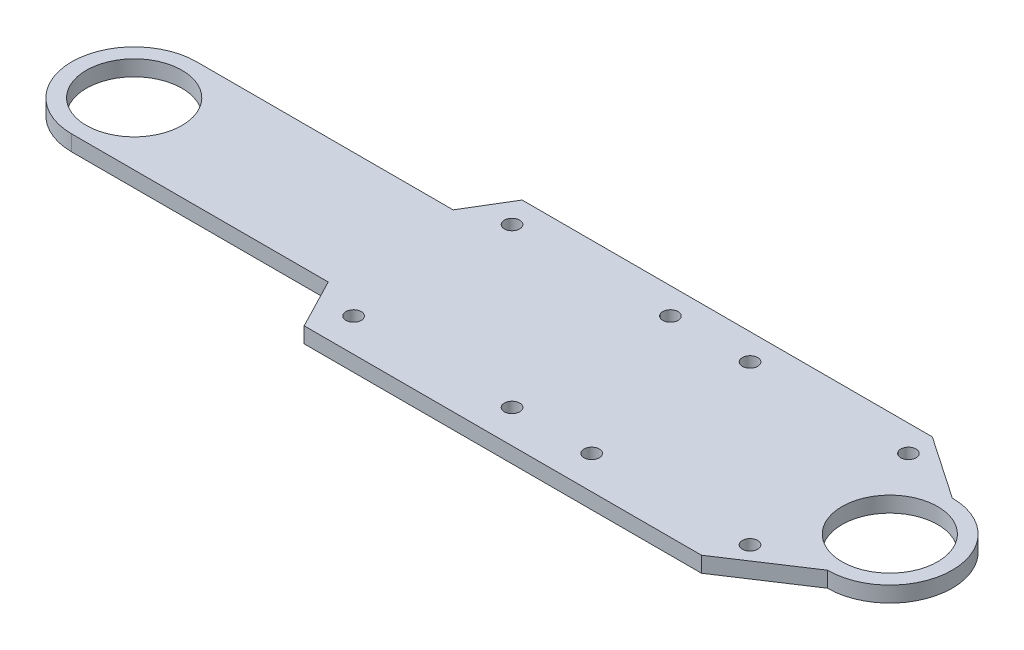
ISO-10303-21;
HEADER;
FILE_DESCRIPTION(('STEP AP214'),'2;1');
FILE_NAME('part.step','',(''),(''),'','','');
FILE_SCHEMA(('AUTOMOTIVE_DESIGN { 1 0 10303 214 1 1 1 1 }'));
ENDSEC;
DATA;
#1=APPLICATION_CONTEXT('core data for automotive mechanical design processes');
#2=APPLICATION_PROTOCOL_DEFINITION('international standard','automotive_design',2000,#1);
#3=PRODUCT_CONTEXT('',#1,'mechanical');
#4=PRODUCT('Part','Part','',(#3));
#5=PRODUCT_RELATED_PRODUCT_CATEGORY('part','',(#4));
#6=PRODUCT_DEFINITION_FORMATION('','',#4);
#7=PRODUCT_DEFINITION_CONTEXT('part definition',#1,'design');
#8=PRODUCT_DEFINITION('design','',#6,#7);
#9=PRODUCT_DEFINITION_SHAPE('','',#8);
#10=(LENGTH_UNIT() NAMED_UNIT(*) SI_UNIT(.MILLI.,.METRE.));
#11=(NAMED_UNIT(*) PLANE_ANGLE_UNIT() SI_UNIT($,.RADIAN.));
#12=(NAMED_UNIT(*) SI_UNIT($,.STERADIAN.) SOLID_ANGLE_UNIT());
#13=UNCERTAINTY_MEASURE_WITH_UNIT(LENGTH_MEASURE(1.E-05),#10,'distance_accuracy_value','');
#14=(GEOMETRIC_REPRESENTATION_CONTEXT(3) GLOBAL_UNCERTAINTY_ASSIGNED_CONTEXT((#13)) GLOBAL_UNIT_ASSIGNED_CONTEXT((#10,
#11,#12)) REPRESENTATION_CONTEXT('',''));
#15=CARTESIAN_POINT('',(0.,0.,0.));
#16=DIRECTION('',(0.,0.,1.));
#17=DIRECTION('',(1.,0.,0.));
#18=AXIS2_PLACEMENT_3D('',#15,#16,#17);
#19=CARTESIAN_POINT('',(180.,1.53,-25.34));
#20=DIRECTION('',(0.,-1.,0.));
#21=DIRECTION('',(0.,0.,-1.));
#22=AXIS2_PLACEMENT_3D('',#19,#20,#21);
#23=PLANE('',#22);
#24=CARTESIAN_POINT('',(163.76,1.53,0.));
#25=DIRECTION('',(0.,1.,0.));
#26=DIRECTION('',(0.,0.,1.));
#27=AXIS2_PLACEMENT_3D('',#24,#25,#26);
#28=CIRCLE('',#27,9.36);
#29=CARTESIAN_POINT('',(163.76,1.53,9.36));
#30=VERTEX_POINT('',#29);
#31=EDGE_CURVE('E176',#30,#30,#28,.T.);
#32=ORIENTED_EDGE('',*,*,#31,.F.);
#33=EDGE_LOOP('',(#32));
#34=FACE_BOUND('',#33,.T.);
#35=CARTESIAN_POINT('',(151.9,1.52999999999999,15.5000000000001));
#36=DIRECTION('',(0.,1.,0.));
#37=DIRECTION('',(0.,0.,1.));
#38=AXIS2_PLACEMENT_3D('',#35,#36,#37);
#39=CIRCLE('',#38,1.5);
#40=CARTESIAN_POINT('',(151.9,1.52999999999999,17.0000000000001));
#41=VERTEX_POINT('',#40);
#42=EDGE_CURVE('E196',#41,#41,#39,.T.);
#43=ORIENTED_EDGE('',*,*,#42,.F.);
#44=EDGE_LOOP('',(#43));
#45=FACE_BOUND('',#44,.T.);
#46=CARTESIAN_POINT('',(151.9,1.53,-15.5));
#47=DIRECTION('',(0.,1.,0.));
#48=DIRECTION('',(0.,0.,1.));
#49=AXIS2_PLACEMENT_3D('',#46,#47,#48);
#50=CIRCLE('',#49,1.5);
#51=CARTESIAN_POINT('',(151.9,1.53,-14.));
#52=VERTEX_POINT('',#51);
#53=EDGE_CURVE('E202',#52,#52,#50,.T.);
#54=ORIENTED_EDGE('',*,*,#53,.F.);
#55=EDGE_LOOP('',(#54));
#56=FACE_BOUND('',#55,.T.);
#57=CARTESIAN_POINT('',(120.9,1.52999999999999,15.5000000000001));
#58=DIRECTION('',(0.,1.,0.));
#59=DIRECTION('',(0.,0.,1.));
#60=AXIS2_PLACEMENT_3D('',#57,#58,#59);
#61=CIRCLE('',#60,1.5);
#62=CARTESIAN_POINT('',(120.9,1.52999999999999,17.));
#63=VERTEX_POINT('',#62);
#64=EDGE_CURVE('E208',#63,#63,#61,.T.);
#65=ORIENTED_EDGE('',*,*,#64,.F.);
#66=EDGE_LOOP('',(#65));
#67=FACE_BOUND('',#66,.T.);
#68=CARTESIAN_POINT('',(120.9,1.53,-15.5));
#69=DIRECTION('',(0.,1.,0.));
#70=DIRECTION('',(0.,0.,1.));
#71=AXIS2_PLACEMENT_3D('',#68,#69,#70);
#72=CIRCLE('',#71,1.5);
#73=CARTESIAN_POINT('',(120.9,1.53,-14.));
#74=VERTEX_POINT('',#73);
#75=EDGE_CURVE('E214',#74,#74,#72,.T.);
#76=ORIENTED_EDGE('',*,*,#75,.F.);
#77=EDGE_LOOP('',(#76));
#78=FACE_BOUND('',#77,.T.);
#79=CARTESIAN_POINT('',(105.32,1.52999999999999,15.5));
#80=DIRECTION('',(0.,1.,0.));
#81=DIRECTION('',(0.,0.,1.));
#82=AXIS2_PLACEMENT_3D('',#79,#80,#81);
#83=CIRCLE('',#82,1.5);
#84=CARTESIAN_POINT('',(105.32,1.52999999999999,17.));
#85=VERTEX_POINT('',#84);
#86=EDGE_CURVE('E220',#85,#85,#83,.T.);
#87=ORIENTED_EDGE('',*,*,#86,.F.);
#88=EDGE_LOOP('',(#87));
#89=FACE_BOUND('',#88,.T.);
#90=CARTESIAN_POINT('',(105.32,1.53,-15.5));
#91=DIRECTION('',(0.,1.,0.));
#92=DIRECTION('',(0.,0.,1.));
#93=AXIS2_PLACEMENT_3D('',#90,#91,#92);
#94=CIRCLE('',#93,1.5);
#95=CARTESIAN_POINT('',(105.32,1.53,-14.));
#96=VERTEX_POINT('',#95);
#97=EDGE_CURVE('E226',#96,#96,#94,.T.);
#98=ORIENTED_EDGE('',*,*,#97,.F.);
#99=EDGE_LOOP('',(#98));
#100=FACE_BOUND('',#99,.T.);
#101=CARTESIAN_POINT('',(74.32,1.52999999999999,15.5));
#102=DIRECTION('',(0.,1.,0.));
#103=DIRECTION('',(0.,0.,1.));
#104=AXIS2_PLACEMENT_3D('',#101,#102,#103);
#105=CIRCLE('',#104,1.5);
#106=CARTESIAN_POINT('',(74.32,1.52999999999999,17.));
#107=VERTEX_POINT('',#106);
#108=EDGE_CURVE('E232',#107,#107,#105,.T.);
#109=ORIENTED_EDGE('',*,*,#108,.F.);
#110=EDGE_LOOP('',(#109));
#111=FACE_BOUND('',#110,.T.);
#112=CARTESIAN_POINT('',(74.32,1.53,-15.5));
#113=DIRECTION('',(0.,1.,0.));
#114=DIRECTION('',(0.,0.,1.));
#115=AXIS2_PLACEMENT_3D('',#112,#113,#114);
#116=CIRCLE('',#115,1.5);
#117=CARTESIAN_POINT('',(74.32,1.53,-14.));
#118=VERTEX_POINT('',#117);
#119=EDGE_CURVE('E238',#118,#118,#116,.T.);
#120=ORIENTED_EDGE('',*,*,#119,.F.);
#121=EDGE_LOOP('',(#120));
#122=FACE_BOUND('',#121,.T.);
#123=CARTESIAN_POINT('',(15.875,1.53,0.));
#124=DIRECTION('',(0.,1.,0.));
#125=DIRECTION('',(0.,0.,1.));
#126=AXIS2_PLACEMENT_3D('',#123,#124,#125);
#127=CIRCLE('',#126,9.36);
#128=CARTESIAN_POINT('',(15.875,1.53,9.36));
#129=VERTEX_POINT('',#128);
#130=EDGE_CURVE('E36',#129,#129,#127,.T.);
#131=ORIENTED_EDGE('',*,*,#130,.F.);
#132=EDGE_LOOP('',(#131));
#133=FACE_BOUND('',#132,.T.);
#134=DIRECTION('',(-0.460317164455001,0.,-0.887754531448929));
#135=VECTOR('',#134,1.);
#136=CARTESIAN_POINT('',(71.1472263170608,1.52999999999999,22.0049942120023));
#137=LINE('',#136,#135);
#138=CARTESIAN_POINT('',(71.1472263170608,1.52999999999999,22.0049942120023));
#139=VERTEX_POINT('',#138);
#140=CARTESIAN_POINT('',(66.0754802171529,1.53,12.2237695907514));
#141=VERTEX_POINT('',#140);
#142=EDGE_CURVE('E122',#139,#141,#137,.T.);
#143=ORIENTED_EDGE('',*,*,#142,.F.);
#144=DIRECTION('',(-1.,0.,0.));
#145=VECTOR('',#144,1.);
#146=CARTESIAN_POINT('',(71.1472263170608,1.52999999999999,22.0049942120023));
#147=LINE('',#146,#145);
#148=CARTESIAN_POINT('',(148.9,1.52999999999999,22.0049942120023));
#149=VERTEX_POINT('',#148);
#150=EDGE_CURVE('E106',#149,#139,#147,.T.);
#151=ORIENTED_EDGE('',*,*,#150,.F.);
#152=DIRECTION('',(-0.835290364916561,0.,0.549809063473456));
#153=VECTOR('',#152,1.);
#154=CARTESIAN_POINT('',(163.76,1.53,12.2237695907514));
#155=LINE('',#154,#153);
#156=CARTESIAN_POINT('',(163.76,1.53,12.2237695907514));
#157=VERTEX_POINT('',#156);
#158=EDGE_CURVE('E119',#157,#149,#155,.T.);
#159=ORIENTED_EDGE('',*,*,#158,.F.);
#160=CARTESIAN_POINT('',(163.76,1.53,0.));
#161=DIRECTION('',(0.,-1.,0.));
#162=DIRECTION('',(0.,0.,1.));
#163=AXIS2_PLACEMENT_3D('',#160,#161,#162);
#164=CIRCLE('',#163,12.2237695907514);
#165=CARTESIAN_POINT('',(163.76,1.53,-12.2237695907514));
#166=VERTEX_POINT('',#165);
#167=EDGE_CURVE('E126',#166,#157,#164,.T.);
#168=ORIENTED_EDGE('',*,*,#167,.F.);
#169=DIRECTION('',(0.825782298625082,0.,0.563989002798349));
#170=VECTOR('',#169,1.);
#171=CARTESIAN_POINT('',(151.437110619845,1.53,-20.64));
#172=LINE('',#171,#170);
#173=CARTESIAN_POINT('',(151.437110619845,1.53,-20.64));
#174=VERTEX_POINT('',#173);
#175=EDGE_CURVE('E147',#174,#166,#172,.T.);
#176=ORIENTED_EDGE('',*,*,#175,.F.);
#177=DIRECTION('',(1.,0.,0.));
#178=VECTOR('',#177,1.);
#179=CARTESIAN_POINT('',(71.1472263170608,1.53,-20.64));
#180=LINE('',#179,#178);
#181=CARTESIAN_POINT('',(71.1472263170608,1.53,-20.64));
#182=VERTEX_POINT('',#181);
#183=EDGE_CURVE('E144',#182,#174,#180,.T.);
#184=ORIENTED_EDGE('',*,*,#183,.F.);
#185=DIRECTION('',(0.516141641976553,0.,-0.856503243086533));
#186=VECTOR('',#185,1.);
#187=CARTESIAN_POINT('',(66.0754802171529,1.53,-12.2237695907514));
#188=LINE('',#187,#186);
#189=CARTESIAN_POINT('',(66.0754802171529,1.53,-12.2237695907514));
#190=VERTEX_POINT('',#189);
#191=EDGE_CURVE('E141',#190,#182,#188,.T.);
#192=ORIENTED_EDGE('',*,*,#191,.F.);
#193=DIRECTION('',(1.,0.,0.));
#194=VECTOR('',#193,1.);
#195=CARTESIAN_POINT('',(15.8750000000001,1.53,-12.2237695907514));
#196=LINE('',#195,#194);
#197=CARTESIAN_POINT('',(15.8750000000001,1.53,-12.2237695907514));
#198=VERTEX_POINT('',#197);
#199=EDGE_CURVE('E138',#198,#190,#196,.T.);
#200=ORIENTED_EDGE('',*,*,#199,.F.);
#201=CARTESIAN_POINT('',(15.875,1.53,0.));
#202=DIRECTION('',(0.,-1.,0.));
#203=DIRECTION('',(0.,0.,-1.));
#204=AXIS2_PLACEMENT_3D('',#201,#202,#203);
#205=CIRCLE('',#204,12.2237695907514);
#206=CARTESIAN_POINT('',(15.875,1.53,12.2237695907514));
#207=VERTEX_POINT('',#206);
#208=EDGE_CURVE('E135',#207,#198,#205,.T.);
#209=ORIENTED_EDGE('',*,*,#208,.F.);
#210=DIRECTION('',(-1.,0.,0.));
#211=VECTOR('',#210,1.);
#212=CARTESIAN_POINT('',(66.0754802171529,1.53,12.2237695907514));
#213=LINE('',#212,#211);
#214=EDGE_CURVE('E128',#141,#207,#213,.T.);
#215=ORIENTED_EDGE('',*,*,#214,.F.);
#216=EDGE_LOOP('',(#143,#151,#159,#168,#176,#184,#192,#200,#209,#215));
#217=FACE_BOUND('',#216,.T.);
#218=ADVANCED_FACE('F29',(#34,#45,#56,#67,#78,#89,#100,#111,#122,#133,#217),#23,.F.);
#219=CARTESIAN_POINT('',(180.,-1.53,-25.34));
#220=DIRECTION('',(0.,1.,0.));
#221=DIRECTION('',(0.,0.,1.));
#222=AXIS2_PLACEMENT_3D('',#219,#220,#221);
#223=PLANE('',#222);
#224=DIRECTION('',(-0.835290364916561,0.,0.549809063473456));
#225=VECTOR('',#224,1.);
#226=CARTESIAN_POINT('',(163.76,-1.53000000000001,12.2237695907514));
#227=LINE('',#226,#225);
#228=CARTESIAN_POINT('',(163.76,-1.53000000000001,12.2237695907514));
#229=VERTEX_POINT('',#228);
#230=CARTESIAN_POINT('',(148.9,-1.53000000000001,22.0049942120023));
#231=VERTEX_POINT('',#230);
#232=EDGE_CURVE('E152',#229,#231,#227,.T.);
#233=ORIENTED_EDGE('',*,*,#232,.T.);
#234=DIRECTION('',(-1.,0.,0.));
#235=VECTOR('',#234,1.);
#236=CARTESIAN_POINT('',(71.1472263170608,-1.53000000000002,22.0049942120023));
#237=LINE('',#236,#235);
#238=CARTESIAN_POINT('',(71.1472263170608,-1.53000000000002,22.0049942120023));
#239=VERTEX_POINT('',#238);
#240=EDGE_CURVE('E43',#231,#239,#237,.T.);
#241=ORIENTED_EDGE('',*,*,#240,.T.);
#242=DIRECTION('',(-0.460317164455001,0.,-0.887754531448929));
#243=VECTOR('',#242,1.);
#244=CARTESIAN_POINT('',(71.1472263170608,-1.53000000000001,22.0049942120023));
#245=LINE('',#244,#243);
#246=CARTESIAN_POINT('',(66.0754802171529,-1.53000000000001,12.2237695907514));
#247=VERTEX_POINT('',#246);
#248=EDGE_CURVE('E154',#239,#247,#245,.T.);
#249=ORIENTED_EDGE('',*,*,#248,.T.);
#250=DIRECTION('',(-1.,0.,0.));
#251=VECTOR('',#250,1.);
#252=CARTESIAN_POINT('',(66.0754802171529,-1.53000000000001,12.2237695907514));
#253=LINE('',#252,#251);
#254=CARTESIAN_POINT('',(15.875,-1.53000000000001,12.2237695907514));
#255=VERTEX_POINT('',#254);
#256=EDGE_CURVE('E157',#247,#255,#253,.T.);
#257=ORIENTED_EDGE('',*,*,#256,.T.);
#258=CARTESIAN_POINT('',(15.875,-1.53000000000001,0.));
#259=DIRECTION('',(0.,-1.,0.));
#260=DIRECTION('',(0.,0.,-1.));
#261=AXIS2_PLACEMENT_3D('',#258,#259,#260);
#262=CIRCLE('',#261,12.2237695907514);
#263=CARTESIAN_POINT('',(15.8750000000001,-1.53000000000001,-12.2237695907514));
#264=VERTEX_POINT('',#263);
#265=EDGE_CURVE('E160',#255,#264,#262,.T.);
#266=ORIENTED_EDGE('',*,*,#265,.T.);
#267=DIRECTION('',(1.,0.,0.));
#268=VECTOR('',#267,1.);
#269=CARTESIAN_POINT('',(15.8750000000001,-1.53000000000001,-12.2237695907514));
#270=LINE('',#269,#268);
#271=CARTESIAN_POINT('',(66.0754802171529,-1.53000000000001,-12.2237695907514));
#272=VERTEX_POINT('',#271);
#273=EDGE_CURVE('E163',#264,#272,#270,.T.);
#274=ORIENTED_EDGE('',*,*,#273,.T.);
#275=DIRECTION('',(0.516141641976553,0.,-0.856503243086533));
#276=VECTOR('',#275,1.);
#277=CARTESIAN_POINT('',(66.0754802171529,-1.53000000000001,-12.2237695907514));
#278=LINE('',#277,#276);
#279=CARTESIAN_POINT('',(71.1472263170608,-1.53000000000001,-20.64));
#280=VERTEX_POINT('',#279);
#281=EDGE_CURVE('E166',#272,#280,#278,.T.);
#282=ORIENTED_EDGE('',*,*,#281,.T.);
#283=DIRECTION('',(1.,0.,0.));
#284=VECTOR('',#283,1.);
#285=CARTESIAN_POINT('',(71.1472263170608,-1.53000000000001,-20.64));
#286=LINE('',#285,#284);
#287=CARTESIAN_POINT('',(151.437110619845,-1.53000000000001,-20.64));
#288=VERTEX_POINT('',#287);
#289=EDGE_CURVE('E169',#280,#288,#286,.T.);
#290=ORIENTED_EDGE('',*,*,#289,.T.);
#291=DIRECTION('',(0.825782298625082,0.,0.563989002798349));
#292=VECTOR('',#291,1.);
#293=CARTESIAN_POINT('',(151.437110619845,-1.53000000000001,-20.64));
#294=LINE('',#293,#292);
#295=CARTESIAN_POINT('',(163.76,-1.53000000000001,-12.2237695907514));
#296=VERTEX_POINT('',#295);
#297=EDGE_CURVE('E172',#288,#296,#294,.T.);
#298=ORIENTED_EDGE('',*,*,#297,.T.);
#299=CARTESIAN_POINT('',(163.76,-1.53000000000001,0.));
#300=DIRECTION('',(0.,-1.,0.));
#301=DIRECTION('',(0.,0.,1.));
#302=AXIS2_PLACEMENT_3D('',#299,#300,#301);
#303=CIRCLE('',#302,12.2237695907514);
#304=EDGE_CURVE('E149',#296,#229,#303,.T.);
#305=ORIENTED_EDGE('',*,*,#304,.T.);
#306=EDGE_LOOP('',(#233,#241,#249,#257,#266,#274,#282,#290,#298,#305));
#307=FACE_BOUND('',#306,.T.);
#308=CARTESIAN_POINT('',(163.76,-1.53000000000001,0.));
#309=DIRECTION('',(0.,1.,0.));
#310=DIRECTION('',(0.,0.,1.));
#311=AXIS2_PLACEMENT_3D('',#308,#309,#310);
#312=CIRCLE('',#311,9.36);
#313=CARTESIAN_POINT('',(163.76,-1.53000000000001,9.36));
#314=VERTEX_POINT('',#313);
#315=EDGE_CURVE('E193',#314,#314,#312,.T.);
#316=ORIENTED_EDGE('',*,*,#315,.T.);
#317=EDGE_LOOP('',(#316));
#318=FACE_BOUND('',#317,.T.);
#319=CARTESIAN_POINT('',(151.9,-1.53000000000001,15.5000000000001));
#320=DIRECTION('',(0.,1.,0.));
#321=DIRECTION('',(0.,0.,1.));
#322=AXIS2_PLACEMENT_3D('',#319,#320,#321);
#323=CIRCLE('',#322,1.5);
#324=CARTESIAN_POINT('',(151.9,-1.53000000000001,17.0000000000001));
#325=VERTEX_POINT('',#324);
#326=EDGE_CURVE('E199',#325,#325,#323,.T.);
#327=ORIENTED_EDGE('',*,*,#326,.T.);
#328=EDGE_LOOP('',(#327));
#329=FACE_BOUND('',#328,.T.);
#330=CARTESIAN_POINT('',(151.9,-1.53000000000001,-15.5));
#331=DIRECTION('',(0.,1.,0.));
#332=DIRECTION('',(0.,0.,1.));
#333=AXIS2_PLACEMENT_3D('',#330,#331,#332);
#334=CIRCLE('',#333,1.5);
#335=CARTESIAN_POINT('',(151.9,-1.53000000000001,-14.));
#336=VERTEX_POINT('',#335);
#337=EDGE_CURVE('E205',#336,#336,#334,.T.);
#338=ORIENTED_EDGE('',*,*,#337,.T.);
#339=EDGE_LOOP('',(#338));
#340=FACE_BOUND('',#339,.T.);
#341=CARTESIAN_POINT('',(120.9,-1.53000000000001,15.5000000000001));
#342=DIRECTION('',(0.,1.,0.));
#343=DIRECTION('',(0.,0.,1.));
#344=AXIS2_PLACEMENT_3D('',#341,#342,#343);
#345=CIRCLE('',#344,1.5);
#346=CARTESIAN_POINT('',(120.9,-1.53000000000001,17.));
#347=VERTEX_POINT('',#346);
#348=EDGE_CURVE('E211',#347,#347,#345,.T.);
#349=ORIENTED_EDGE('',*,*,#348,.T.);
#350=EDGE_LOOP('',(#349));
#351=FACE_BOUND('',#350,.T.);
#352=CARTESIAN_POINT('',(120.9,-1.53000000000001,-15.5));
#353=DIRECTION('',(0.,1.,0.));
#354=DIRECTION('',(0.,0.,1.));
#355=AXIS2_PLACEMENT_3D('',#352,#353,#354);
#356=CIRCLE('',#355,1.5);
#357=CARTESIAN_POINT('',(120.9,-1.53000000000001,-14.));
#358=VERTEX_POINT('',#357);
#359=EDGE_CURVE('E217',#358,#358,#356,.T.);
#360=ORIENTED_EDGE('',*,*,#359,.T.);
#361=EDGE_LOOP('',(#360));
#362=FACE_BOUND('',#361,.T.);
#363=CARTESIAN_POINT('',(105.32,-1.53000000000001,15.5));
#364=DIRECTION('',(0.,1.,0.));
#365=DIRECTION('',(0.,0.,1.));
#366=AXIS2_PLACEMENT_3D('',#363,#364,#365);
#367=CIRCLE('',#366,1.5);
#368=CARTESIAN_POINT('',(105.32,-1.53000000000001,17.));
#369=VERTEX_POINT('',#368);
#370=EDGE_CURVE('E223',#369,#369,#367,.T.);
#371=ORIENTED_EDGE('',*,*,#370,.T.);
#372=EDGE_LOOP('',(#371));
#373=FACE_BOUND('',#372,.T.);
#374=CARTESIAN_POINT('',(105.32,-1.53000000000001,-15.5));
#375=DIRECTION('',(0.,1.,0.));
#376=DIRECTION('',(0.,0.,1.));
#377=AXIS2_PLACEMENT_3D('',#374,#375,#376);
#378=CIRCLE('',#377,1.5);
#379=CARTESIAN_POINT('',(105.32,-1.53000000000001,-14.));
#380=VERTEX_POINT('',#379);
#381=EDGE_CURVE('E229',#380,#380,#378,.T.);
#382=ORIENTED_EDGE('',*,*,#381,.T.);
#383=EDGE_LOOP('',(#382));
#384=FACE_BOUND('',#383,.T.);
#385=CARTESIAN_POINT('',(74.32,-1.53000000000001,15.5));
#386=DIRECTION('',(0.,1.,0.));
#387=DIRECTION('',(0.,0.,1.));
#388=AXIS2_PLACEMENT_3D('',#385,#386,#387);
#389=CIRCLE('',#388,1.5);
#390=CARTESIAN_POINT('',(74.32,-1.53000000000001,17.));
#391=VERTEX_POINT('',#390);
#392=EDGE_CURVE('E235',#391,#391,#389,.T.);
#393=ORIENTED_EDGE('',*,*,#392,.T.);
#394=EDGE_LOOP('',(#393));
#395=FACE_BOUND('',#394,.T.);
#396=CARTESIAN_POINT('',(74.32,-1.53000000000001,-15.5));
#397=DIRECTION('',(0.,1.,0.));
#398=DIRECTION('',(0.,0.,1.));
#399=AXIS2_PLACEMENT_3D('',#396,#397,#398);
#400=CIRCLE('',#399,1.5);
#401=CARTESIAN_POINT('',(74.32,-1.53000000000001,-14.));
#402=VERTEX_POINT('',#401);
#403=EDGE_CURVE('E241',#402,#402,#400,.T.);
#404=ORIENTED_EDGE('',*,*,#403,.T.);
#405=EDGE_LOOP('',(#404));
#406=FACE_BOUND('',#405,.T.);
#407=CARTESIAN_POINT('',(15.875,-1.53000000000001,0.));
#408=DIRECTION('',(0.,1.,0.));
#409=DIRECTION('',(0.,0.,1.));
#410=AXIS2_PLACEMENT_3D('',#407,#408,#409);
#411=CIRCLE('',#410,9.36);
#412=CARTESIAN_POINT('',(15.875,-1.53000000000001,9.36));
#413=VERTEX_POINT('',#412);
#414=EDGE_CURVE('E11',#413,#413,#411,.T.);
#415=ORIENTED_EDGE('',*,*,#414,.T.);
#416=EDGE_LOOP('',(#415));
#417=FACE_BOUND('',#416,.T.);
#418=ADVANCED_FACE('F249',(#307,#318,#329,#340,#351,#362,#373,#384,#395,#406,#417),#223,.F.);
#419=CARTESIAN_POINT('',(15.875,-1.53000000000001,0.));
#420=DIRECTION('',(0.,1.,0.));
#421=DIRECTION('',(0.,0.,1.));
#422=AXIS2_PLACEMENT_3D('',#419,#420,#421);
#423=CYLINDRICAL_SURFACE('',#422,9.36);
#424=ORIENTED_EDGE('',*,*,#414,.F.);
#425=EDGE_LOOP('',(#424));
#426=FACE_BOUND('',#425,.T.);
#427=ORIENTED_EDGE('',*,*,#130,.T.);
#428=EDGE_LOOP('',(#427));
#429=FACE_BOUND('',#428,.T.);
#430=ADVANCED_FACE('F246',(#426,#429),#423,.F.);
#431=CARTESIAN_POINT('',(74.32,-1.53000000000001,-15.5));
#432=DIRECTION('',(0.,1.,0.));
#433=DIRECTION('',(0.,0.,1.));
#434=AXIS2_PLACEMENT_3D('',#431,#432,#433);
#435=CYLINDRICAL_SURFACE('',#434,1.5);
#436=ORIENTED_EDGE('',*,*,#403,.F.);
#437=EDGE_LOOP('',(#436));
#438=FACE_BOUND('',#437,.T.);
#439=ORIENTED_EDGE('',*,*,#119,.T.);
#440=EDGE_LOOP('',(#439));
#441=FACE_BOUND('',#440,.T.);
#442=ADVANCED_FACE('F273',(#438,#441),#435,.F.);
#443=CARTESIAN_POINT('',(74.32,-1.53000000000001,15.5));
#444=DIRECTION('',(0.,1.,0.));
#445=DIRECTION('',(0.,0.,1.));
#446=AXIS2_PLACEMENT_3D('',#443,#444,#445);
#447=CYLINDRICAL_SURFACE('',#446,1.5);
#448=ORIENTED_EDGE('',*,*,#392,.F.);
#449=EDGE_LOOP('',(#448));
#450=FACE_BOUND('',#449,.T.);
#451=ORIENTED_EDGE('',*,*,#108,.T.);
#452=EDGE_LOOP('',(#451));
#453=FACE_BOUND('',#452,.T.);
#454=ADVANCED_FACE('F275',(#450,#453),#447,.F.);
#455=CARTESIAN_POINT('',(105.32,-1.53000000000001,-15.5));
#456=DIRECTION('',(0.,1.,0.));
#457=DIRECTION('',(0.,0.,1.));
#458=AXIS2_PLACEMENT_3D('',#455,#456,#457);
#459=CYLINDRICAL_SURFACE('',#458,1.5);
#460=ORIENTED_EDGE('',*,*,#381,.F.);
#461=EDGE_LOOP('',(#460));
#462=FACE_BOUND('',#461,.T.);
#463=ORIENTED_EDGE('',*,*,#97,.T.);
#464=EDGE_LOOP('',(#463));
#465=FACE_BOUND('',#464,.T.);
#466=ADVANCED_FACE('F282',(#462,#465),#459,.F.);
#467=CARTESIAN_POINT('',(105.32,-1.53000000000001,15.5));
#468=DIRECTION('',(0.,1.,0.));
#469=DIRECTION('',(0.,0.,1.));
#470=AXIS2_PLACEMENT_3D('',#467,#468,#469);
#471=CYLINDRICAL_SURFACE('',#470,1.5);
#472=ORIENTED_EDGE('',*,*,#370,.F.);
#473=EDGE_LOOP('',(#472));
#474=FACE_BOUND('',#473,.T.);
#475=ORIENTED_EDGE('',*,*,#86,.T.);
#476=EDGE_LOOP('',(#475));
#477=FACE_BOUND('',#476,.T.);
#478=ADVANCED_FACE('F291',(#474,#477),#471,.F.);
#479=CARTESIAN_POINT('',(120.9,-1.53000000000001,-15.5));
#480=DIRECTION('',(0.,1.,0.));
#481=DIRECTION('',(0.,0.,1.));
#482=AXIS2_PLACEMENT_3D('',#479,#480,#481);
#483=CYLINDRICAL_SURFACE('',#482,1.5);
#484=ORIENTED_EDGE('',*,*,#359,.F.);
#485=EDGE_LOOP('',(#484));
#486=FACE_BOUND('',#485,.T.);
#487=ORIENTED_EDGE('',*,*,#75,.T.);
#488=EDGE_LOOP('',(#487));
#489=FACE_BOUND('',#488,.T.);
#490=ADVANCED_FACE('F295',(#486,#489),#483,.F.);
#491=CARTESIAN_POINT('',(120.9,-1.53000000000001,15.5000000000001));
#492=DIRECTION('',(0.,1.,0.));
#493=DIRECTION('',(0.,0.,1.));
#494=AXIS2_PLACEMENT_3D('',#491,#492,#493);
#495=CYLINDRICAL_SURFACE('',#494,1.5);
#496=ORIENTED_EDGE('',*,*,#348,.F.);
#497=EDGE_LOOP('',(#496));
#498=FACE_BOUND('',#497,.T.);
#499=ORIENTED_EDGE('',*,*,#64,.T.);
#500=EDGE_LOOP('',(#499));
#501=FACE_BOUND('',#500,.T.);
#502=ADVANCED_FACE('F299',(#498,#501),#495,.F.);
#503=CARTESIAN_POINT('',(151.9,-1.53000000000001,-15.5));
#504=DIRECTION('',(0.,1.,0.));
#505=DIRECTION('',(0.,0.,1.));
#506=AXIS2_PLACEMENT_3D('',#503,#504,#505);
#507=CYLINDRICAL_SURFACE('',#506,1.5);
#508=ORIENTED_EDGE('',*,*,#337,.F.);
#509=EDGE_LOOP('',(#508));
#510=FACE_BOUND('',#509,.T.);
#511=ORIENTED_EDGE('',*,*,#53,.T.);
#512=EDGE_LOOP('',(#511));
#513=FACE_BOUND('',#512,.T.);
#514=ADVANCED_FACE('F303',(#510,#513),#507,.F.);
#515=CARTESIAN_POINT('',(151.9,-1.53000000000001,15.5000000000001));
#516=DIRECTION('',(0.,1.,0.));
#517=DIRECTION('',(0.,0.,1.));
#518=AXIS2_PLACEMENT_3D('',#515,#516,#517);
#519=CYLINDRICAL_SURFACE('',#518,1.5);
#520=ORIENTED_EDGE('',*,*,#326,.F.);
#521=EDGE_LOOP('',(#520));
#522=FACE_BOUND('',#521,.T.);
#523=ORIENTED_EDGE('',*,*,#42,.T.);
#524=EDGE_LOOP('',(#523));
#525=FACE_BOUND('',#524,.T.);
#526=ADVANCED_FACE('F307',(#522,#525),#519,.F.);
#527=CARTESIAN_POINT('',(163.76,-1.53000000000001,0.));
#528=DIRECTION('',(0.,1.,0.));
#529=DIRECTION('',(0.,0.,1.));
#530=AXIS2_PLACEMENT_3D('',#527,#528,#529);
#531=CYLINDRICAL_SURFACE('',#530,9.36);
#532=ORIENTED_EDGE('',*,*,#315,.F.);
#533=EDGE_LOOP('',(#532));
#534=FACE_BOUND('',#533,.T.);
#535=ORIENTED_EDGE('',*,*,#31,.T.);
#536=EDGE_LOOP('',(#535));
#537=FACE_BOUND('',#536,.T.);
#538=ADVANCED_FACE('F311',(#534,#537),#531,.F.);
#539=CARTESIAN_POINT('',(163.76,-1.53000000000001,0.));
#540=DIRECTION('',(0.,1.,0.));
#541=DIRECTION('',(0.,0.,1.));
#542=AXIS2_PLACEMENT_3D('',#539,#540,#541);
#543=CYLINDRICAL_SURFACE('',#542,12.2237695907514);
#544=ORIENTED_EDGE('',*,*,#167,.T.);
#545=DIRECTION('',(0.,1.,0.));
#546=VECTOR('',#545,1.);
#547=CARTESIAN_POINT('',(163.76,-1.53000000000001,12.2237695907514));
#548=LINE('',#547,#546);
#549=EDGE_CURVE('E113',#229,#157,#548,.T.);
#550=ORIENTED_EDGE('',*,*,#549,.F.);
#551=ORIENTED_EDGE('',*,*,#304,.F.);
#552=DIRECTION('',(0.,1.,0.));
#553=VECTOR('',#552,1.);
#554=CARTESIAN_POINT('',(163.76,-1.53000000000001,-12.2237695907514));
#555=LINE('',#554,#553);
#556=EDGE_CURVE('E51',#296,#166,#555,.T.);
#557=ORIENTED_EDGE('',*,*,#556,.T.);
#558=EDGE_LOOP('',(#544,#550,#551,#557));
#559=FACE_BOUND('',#558,.T.);
#560=ADVANCED_FACE('F315',(#559),#543,.T.);
#561=CARTESIAN_POINT('',(151.437110619845,-1.53000000000001,-20.64));
#562=DIRECTION('',(-0.563989002798349,0.,0.825782298625082));
#563=DIRECTION('',(0.825782298625082,0.,0.563989002798349));
#564=AXIS2_PLACEMENT_3D('',#561,#562,#563);
#565=PLANE('',#564);
#566=ORIENTED_EDGE('',*,*,#175,.T.);
#567=ORIENTED_EDGE('',*,*,#556,.F.);
#568=ORIENTED_EDGE('',*,*,#297,.F.);
#569=DIRECTION('',(0.,1.,0.));
#570=VECTOR('',#569,1.);
#571=CARTESIAN_POINT('',(151.437110619845,-1.53000000000001,-20.64));
#572=LINE('',#571,#570);
#573=EDGE_CURVE('E177',#288,#174,#572,.T.);
#574=ORIENTED_EDGE('',*,*,#573,.T.);
#575=EDGE_LOOP('',(#566,#567,#568,#574));
#576=FACE_BOUND('',#575,.T.);
#577=ADVANCED_FACE('F319',(#576),#565,.F.);
#578=CARTESIAN_POINT('',(71.1472263170608,-1.53000000000001,-20.64));
#579=DIRECTION('',(0.,0.,1.));
#580=DIRECTION('',(1.,0.,0.));
#581=AXIS2_PLACEMENT_3D('',#578,#579,#580);
#582=PLANE('',#581);
#583=ORIENTED_EDGE('',*,*,#183,.T.);
#584=ORIENTED_EDGE('',*,*,#573,.F.);
#585=ORIENTED_EDGE('',*,*,#289,.F.);
#586=DIRECTION('',(0.,1.,0.));
#587=VECTOR('',#586,1.);
#588=CARTESIAN_POINT('',(71.1472263170608,-1.53000000000001,-20.64));
#589=LINE('',#588,#587);
#590=EDGE_CURVE('E179',#280,#182,#589,.T.);
#591=ORIENTED_EDGE('',*,*,#590,.T.);
#592=EDGE_LOOP('',(#583,#584,#585,#591));
#593=FACE_BOUND('',#592,.T.);
#594=ADVANCED_FACE('F342',(#593),#582,.F.);
#595=CARTESIAN_POINT('',(66.0754802171529,-1.53000000000001,-12.2237695907514));
#596=DIRECTION('',(0.856503243086533,0.,0.516141641976553));
#597=DIRECTION('',(0.516141641976553,0.,-0.856503243086533));
#598=AXIS2_PLACEMENT_3D('',#595,#596,#597);
#599=PLANE('',#598);
#600=ORIENTED_EDGE('',*,*,#191,.T.);
#601=ORIENTED_EDGE('',*,*,#590,.F.);
#602=ORIENTED_EDGE('',*,*,#281,.F.);
#603=DIRECTION('',(0.,1.,0.));
#604=VECTOR('',#603,1.);
#605=CARTESIAN_POINT('',(66.0754802171529,-1.53000000000001,-12.2237695907514));
#606=LINE('',#605,#604);
#607=EDGE_CURVE('E181',#272,#190,#606,.T.);
#608=ORIENTED_EDGE('',*,*,#607,.T.);
#609=EDGE_LOOP('',(#600,#601,#602,#608));
#610=FACE_BOUND('',#609,.T.);
#611=ADVANCED_FACE('F338',(#610),#599,.F.);
#612=CARTESIAN_POINT('',(15.8750000000001,-1.53000000000001,-12.2237695907514));
#613=DIRECTION('',(0.,0.,1.));
#614=DIRECTION('',(1.,0.,0.));
#615=AXIS2_PLACEMENT_3D('',#612,#613,#614);
#616=PLANE('',#615);
#617=ORIENTED_EDGE('',*,*,#199,.T.);
#618=ORIENTED_EDGE('',*,*,#607,.F.);
#619=ORIENTED_EDGE('',*,*,#273,.F.);
#620=DIRECTION('',(0.,1.,0.));
#621=VECTOR('',#620,1.);
#622=CARTESIAN_POINT('',(15.8750000000001,-1.53000000000001,-12.2237695907514));
#623=LINE('',#622,#621);
#624=EDGE_CURVE('E183',#264,#198,#623,.T.);
#625=ORIENTED_EDGE('',*,*,#624,.T.);
#626=EDGE_LOOP('',(#617,#618,#619,#625));
#627=FACE_BOUND('',#626,.T.);
#628=ADVANCED_FACE('F334',(#627),#616,.F.);
#629=CARTESIAN_POINT('',(15.875,-1.53000000000001,0.));
#630=DIRECTION('',(0.,1.,0.));
#631=DIRECTION('',(0.,0.,1.));
#632=AXIS2_PLACEMENT_3D('',#629,#630,#631);
#633=CYLINDRICAL_SURFACE('',#632,12.2237695907514);
#634=ORIENTED_EDGE('',*,*,#208,.T.);
#635=ORIENTED_EDGE('',*,*,#624,.F.);
#636=ORIENTED_EDGE('',*,*,#265,.F.);
#637=DIRECTION('',(0.,1.,0.));
#638=VECTOR('',#637,1.);
#639=CARTESIAN_POINT('',(15.875,-1.53000000000001,12.2237695907514));
#640=LINE('',#639,#638);
#641=EDGE_CURVE('E185',#255,#207,#640,.T.);
#642=ORIENTED_EDGE('',*,*,#641,.T.);
#643=EDGE_LOOP('',(#634,#635,#636,#642));
#644=FACE_BOUND('',#643,.T.);
#645=ADVANCED_FACE('F330',(#644),#633,.T.);
#646=CARTESIAN_POINT('',(66.0754802171529,-1.53000000000001,12.2237695907514));
#647=DIRECTION('',(0.,0.,-1.));
#648=DIRECTION('',(0.,1.,0.));
#649=AXIS2_PLACEMENT_3D('',#646,#647,#648);
#650=PLANE('',#649);
#651=ORIENTED_EDGE('',*,*,#214,.T.);
#652=ORIENTED_EDGE('',*,*,#641,.F.);
#653=ORIENTED_EDGE('',*,*,#256,.F.);
#654=DIRECTION('',(0.,1.,0.));
#655=VECTOR('',#654,1.);
#656=CARTESIAN_POINT('',(66.0754802171529,-1.53000000000001,12.2237695907514));
#657=LINE('',#656,#655);
#658=EDGE_CURVE('E187',#247,#141,#657,.T.);
#659=ORIENTED_EDGE('',*,*,#658,.T.);
#660=EDGE_LOOP('',(#651,#652,#653,#659));
#661=FACE_BOUND('',#660,.T.);
#662=ADVANCED_FACE('F326',(#661),#650,.F.);
#663=CARTESIAN_POINT('',(71.1472263170608,-1.53000000000001,22.0049942120023));
#664=DIRECTION('',(0.887754531448929,0.,-0.460317164455001));
#665=DIRECTION('',(-0.460317164455001,0.,-0.887754531448929));
#666=AXIS2_PLACEMENT_3D('',#663,#664,#665);
#667=PLANE('',#666);
#668=ORIENTED_EDGE('',*,*,#142,.T.);
#669=ORIENTED_EDGE('',*,*,#658,.F.);
#670=ORIENTED_EDGE('',*,*,#248,.F.);
#671=DIRECTION('',(0.,1.,0.));
#672=VECTOR('',#671,1.);
#673=CARTESIAN_POINT('',(71.1472263170608,-1.53000000000001,22.0049942120023));
#674=LINE('',#673,#672);
#675=EDGE_CURVE('E112',#239,#139,#674,.T.);
#676=ORIENTED_EDGE('',*,*,#675,.T.);
#677=EDGE_LOOP('',(#668,#669,#670,#676));
#678=FACE_BOUND('',#677,.T.);
#679=ADVANCED_FACE('F323',(#678),#667,.F.);
#680=CARTESIAN_POINT('',(163.76,-1.53000000000001,12.2237695907514));
#681=DIRECTION('',(-0.549809063473456,0.,-0.835290364916561));
#682=DIRECTION('',(-0.835290364916561,0.,0.549809063473456));
#683=AXIS2_PLACEMENT_3D('',#680,#681,#682);
#684=PLANE('',#683);
#685=ORIENTED_EDGE('',*,*,#158,.T.);
#686=DIRECTION('',(0.,1.,0.));
#687=VECTOR('',#686,1.);
#688=CARTESIAN_POINT('',(148.9,-1.53000000000001,22.0049942120023));
#689=LINE('',#688,#687);
#690=EDGE_CURVE('E103',#231,#149,#689,.T.);
#691=ORIENTED_EDGE('',*,*,#690,.F.);
#692=ORIENTED_EDGE('',*,*,#232,.F.);
#693=ORIENTED_EDGE('',*,*,#549,.T.);
#694=EDGE_LOOP('',(#685,#691,#692,#693));
#695=FACE_BOUND('',#694,.T.);
#696=ADVANCED_FACE('F124',(#695),#684,.F.);
#697=CARTESIAN_POINT('',(71.1472263170608,-1.53000000000002,22.0049942120023));
#698=DIRECTION('',(0.,0.,-1.));
#699=DIRECTION('',(0.,1.,0.));
#700=AXIS2_PLACEMENT_3D('',#697,#698,#699);
#701=PLANE('',#700);
#702=ORIENTED_EDGE('',*,*,#150,.T.);
#703=ORIENTED_EDGE('',*,*,#675,.F.);
#704=ORIENTED_EDGE('',*,*,#240,.F.);
#705=ORIENTED_EDGE('',*,*,#690,.T.);
#706=EDGE_LOOP('',(#702,#703,#704,#705));
#707=FACE_BOUND('',#706,.T.);
#708=ADVANCED_FACE('F105',(#707),#701,.F.);
#709=CLOSED_SHELL('',(#218,#418,#430,#442,#454,#466,#478,#490,#502,#514,#526,#538,#560,#577,
#594,#611,#628,#645,#662,#679,#696,#708));
#710=MANIFOLD_SOLID_BREP('B2',#709);
#711=ADVANCED_BREP_SHAPE_REPRESENTATION('',(#18,#710),#14);
#712=SHAPE_DEFINITION_REPRESENTATION(#9,#711);
ENDSEC;
END-ISO-10303-21;
